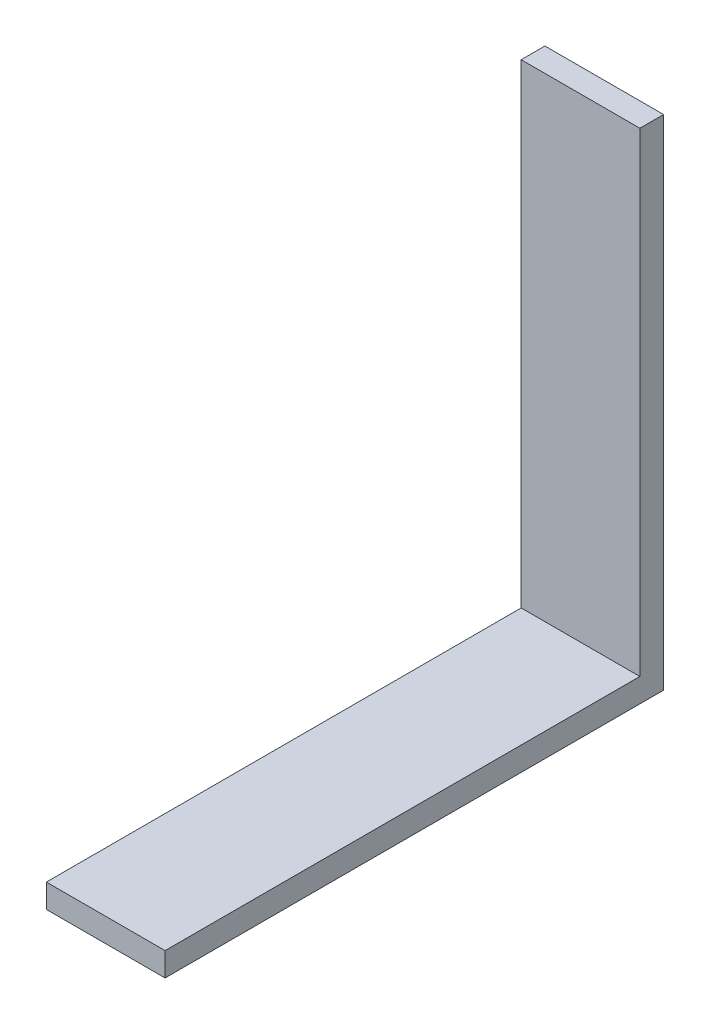
ISO-10303-21;
HEADER;
FILE_DESCRIPTION(('STEP AP214'),'2;1');
FILE_NAME('part.step','',(''),(''),'','','');
FILE_SCHEMA(('AUTOMOTIVE_DESIGN { 1 0 10303 214 1 1 1 1 }'));
ENDSEC;
DATA;
#1=APPLICATION_CONTEXT('core data for automotive mechanical design processes');
#2=APPLICATION_PROTOCOL_DEFINITION('international standard','automotive_design',2000,#1);
#3=PRODUCT_CONTEXT('',#1,'mechanical');
#4=PRODUCT('Part','Part','',(#3));
#5=PRODUCT_RELATED_PRODUCT_CATEGORY('part','',(#4));
#6=PRODUCT_DEFINITION_FORMATION('','',#4);
#7=PRODUCT_DEFINITION_CONTEXT('part definition',#1,'design');
#8=PRODUCT_DEFINITION('design','',#6,#7);
#9=PRODUCT_DEFINITION_SHAPE('','',#8);
#10=(LENGTH_UNIT() NAMED_UNIT(*) SI_UNIT(.MILLI.,.METRE.));
#11=(NAMED_UNIT(*) PLANE_ANGLE_UNIT() SI_UNIT($,.RADIAN.));
#12=(NAMED_UNIT(*) SI_UNIT($,.STERADIAN.) SOLID_ANGLE_UNIT());
#13=UNCERTAINTY_MEASURE_WITH_UNIT(LENGTH_MEASURE(1.E-05),#10,'distance_accuracy_value','');
#14=(GEOMETRIC_REPRESENTATION_CONTEXT(3) GLOBAL_UNCERTAINTY_ASSIGNED_CONTEXT((#13)) GLOBAL_UNIT_ASSIGNED_CONTEXT((#10,
#11,#12)) REPRESENTATION_CONTEXT('',''));
#15=CARTESIAN_POINT('',(0.,0.,0.));
#16=DIRECTION('',(0.,0.,1.));
#17=DIRECTION('',(1.,0.,0.));
#18=AXIS2_PLACEMENT_3D('',#15,#16,#17);
#19=CARTESIAN_POINT('',(5.,2.00000000000001,42.));
#20=DIRECTION('',(0.,0.,-1.));
#21=DIRECTION('',(-1.,0.,0.));
#22=AXIS2_PLACEMENT_3D('',#19,#20,#21);
#23=PLANE('',#22);
#24=DIRECTION('',(0.,-1.,0.));
#25=VECTOR('',#24,1.);
#26=CARTESIAN_POINT('',(-5.,2.00000000000001,42.));
#27=LINE('',#26,#25);
#28=CARTESIAN_POINT('',(-5.,2.00000000000001,42.));
#29=VERTEX_POINT('',#28);
#30=CARTESIAN_POINT('',(-5.,0.,42.));
#31=VERTEX_POINT('',#30);
#32=EDGE_CURVE('E116',#29,#31,#27,.T.);
#33=ORIENTED_EDGE('',*,*,#32,.T.);
#34=DIRECTION('',(-1.,0.,0.));
#35=VECTOR('',#34,1.);
#36=CARTESIAN_POINT('',(5.,0.,42.));
#37=LINE('',#36,#35);
#38=CARTESIAN_POINT('',(5.,0.,42.));
#39=VERTEX_POINT('',#38);
#40=EDGE_CURVE('E11',#39,#31,#37,.T.);
#41=ORIENTED_EDGE('',*,*,#40,.F.);
#42=DIRECTION('',(0.,-1.,0.));
#43=VECTOR('',#42,1.);
#44=CARTESIAN_POINT('',(5.,2.00000000000001,42.));
#45=LINE('',#44,#43);
#46=CARTESIAN_POINT('',(5.,2.00000000000001,42.));
#47=VERTEX_POINT('',#46);
#48=EDGE_CURVE('E126',#47,#39,#45,.T.);
#49=ORIENTED_EDGE('',*,*,#48,.F.);
#50=DIRECTION('',(-1.,0.,0.));
#51=VECTOR('',#50,1.);
#52=CARTESIAN_POINT('',(5.,2.00000000000001,42.));
#53=LINE('',#52,#51);
#54=EDGE_CURVE('E112',#47,#29,#53,.T.);
#55=ORIENTED_EDGE('',*,*,#54,.T.);
#56=EDGE_LOOP('',(#33,#41,#49,#55));
#57=FACE_BOUND('',#56,.T.);
#58=ADVANCED_FACE('F32',(#57),#23,.F.);
#59=CARTESIAN_POINT('',(5.,0.,42.));
#60=DIRECTION('',(0.,1.,0.));
#61=DIRECTION('',(0.,0.,1.));
#62=AXIS2_PLACEMENT_3D('',#59,#60,#61);
#63=PLANE('',#62);
#64=DIRECTION('',(0.,0.,-1.));
#65=VECTOR('',#64,1.);
#66=CARTESIAN_POINT('',(-5.,0.,42.));
#67=LINE('',#66,#65);
#68=CARTESIAN_POINT('',(-5.,0.,0.));
#69=VERTEX_POINT('',#68);
#70=EDGE_CURVE('E119',#31,#69,#67,.T.);
#71=ORIENTED_EDGE('',*,*,#70,.T.);
#72=DIRECTION('',(-1.,0.,0.));
#73=VECTOR('',#72,1.);
#74=CARTESIAN_POINT('',(5.,0.,0.));
#75=LINE('',#74,#73);
#76=CARTESIAN_POINT('',(5.,0.,0.));
#77=VERTEX_POINT('',#76);
#78=EDGE_CURVE('E40',#77,#69,#75,.T.);
#79=ORIENTED_EDGE('',*,*,#78,.F.);
#80=DIRECTION('',(0.,0.,-1.));
#81=VECTOR('',#80,1.);
#82=CARTESIAN_POINT('',(5.,0.,42.));
#83=LINE('',#82,#81);
#84=EDGE_CURVE('E85',#39,#77,#83,.T.);
#85=ORIENTED_EDGE('',*,*,#84,.F.);
#86=ORIENTED_EDGE('',*,*,#40,.T.);
#87=EDGE_LOOP('',(#71,#79,#85,#86));
#88=FACE_BOUND('',#87,.T.);
#89=ADVANCED_FACE('F150',(#88),#63,.F.);
#90=CARTESIAN_POINT('',(5.,0.,0.));
#91=DIRECTION('',(0.,0.,1.));
#92=DIRECTION('',(0.,-1.,0.));
#93=AXIS2_PLACEMENT_3D('',#90,#91,#92);
#94=PLANE('',#93);
#95=DIRECTION('',(0.,1.,0.));
#96=VECTOR('',#95,1.);
#97=CARTESIAN_POINT('',(-5.,0.,0.));
#98=LINE('',#97,#96);
#99=CARTESIAN_POINT('',(-5.,42.,0.));
#100=VERTEX_POINT('',#99);
#101=EDGE_CURVE('E121',#69,#100,#98,.T.);
#102=ORIENTED_EDGE('',*,*,#101,.T.);
#103=DIRECTION('',(-1.,0.,0.));
#104=VECTOR('',#103,1.);
#105=CARTESIAN_POINT('',(5.,42.,0.));
#106=LINE('',#105,#104);
#107=CARTESIAN_POINT('',(5.,42.,0.));
#108=VERTEX_POINT('',#107);
#109=EDGE_CURVE('E107',#108,#100,#106,.T.);
#110=ORIENTED_EDGE('',*,*,#109,.F.);
#111=DIRECTION('',(0.,1.,0.));
#112=VECTOR('',#111,1.);
#113=CARTESIAN_POINT('',(5.,0.,0.));
#114=LINE('',#113,#112);
#115=EDGE_CURVE('E98',#77,#108,#114,.T.);
#116=ORIENTED_EDGE('',*,*,#115,.F.);
#117=ORIENTED_EDGE('',*,*,#78,.T.);
#118=EDGE_LOOP('',(#102,#110,#116,#117));
#119=FACE_BOUND('',#118,.T.);
#120=ADVANCED_FACE('F132',(#119),#94,.F.);
#121=CARTESIAN_POINT('',(5.,42.,0.));
#122=DIRECTION('',(0.,-1.,0.));
#123=DIRECTION('',(0.,0.,-1.));
#124=AXIS2_PLACEMENT_3D('',#121,#122,#123);
#125=PLANE('',#124);
#126=DIRECTION('',(0.,0.,1.));
#127=VECTOR('',#126,1.);
#128=CARTESIAN_POINT('',(-5.,42.,0.));
#129=LINE('',#128,#127);
#130=CARTESIAN_POINT('',(-5.,42.,2.));
#131=VERTEX_POINT('',#130);
#132=EDGE_CURVE('E106',#100,#131,#129,.T.);
#133=ORIENTED_EDGE('',*,*,#132,.T.);
#134=DIRECTION('',(-1.,0.,0.));
#135=VECTOR('',#134,1.);
#136=CARTESIAN_POINT('',(5.,42.,2.));
#137=LINE('',#136,#135);
#138=CARTESIAN_POINT('',(5.,42.,2.));
#139=VERTEX_POINT('',#138);
#140=EDGE_CURVE('E103',#139,#131,#137,.T.);
#141=ORIENTED_EDGE('',*,*,#140,.F.);
#142=DIRECTION('',(0.,0.,1.));
#143=VECTOR('',#142,1.);
#144=CARTESIAN_POINT('',(5.,42.,0.));
#145=LINE('',#144,#143);
#146=EDGE_CURVE('E92',#108,#139,#145,.T.);
#147=ORIENTED_EDGE('',*,*,#146,.F.);
#148=ORIENTED_EDGE('',*,*,#109,.T.);
#149=EDGE_LOOP('',(#133,#141,#147,#148));
#150=FACE_BOUND('',#149,.T.);
#151=ADVANCED_FACE('F104',(#150),#125,.F.);
#152=CARTESIAN_POINT('',(5.,42.,2.));
#153=DIRECTION('',(0.,0.,-1.));
#154=DIRECTION('',(0.,1.,0.));
#155=AXIS2_PLACEMENT_3D('',#152,#153,#154);
#156=PLANE('',#155);
#157=DIRECTION('',(0.,-1.,0.));
#158=VECTOR('',#157,1.);
#159=CARTESIAN_POINT('',(-5.,42.,2.));
#160=LINE('',#159,#158);
#161=CARTESIAN_POINT('',(-5.,2.00000000000002,2.));
#162=VERTEX_POINT('',#161);
#163=EDGE_CURVE('E71',#131,#162,#160,.T.);
#164=ORIENTED_EDGE('',*,*,#163,.T.);
#165=DIRECTION('',(-1.,0.,0.));
#166=VECTOR('',#165,1.);
#167=CARTESIAN_POINT('',(5.,2.00000000000002,2.));
#168=LINE('',#167,#166);
#169=CARTESIAN_POINT('',(5.,2.00000000000002,2.));
#170=VERTEX_POINT('',#169);
#171=EDGE_CURVE('E108',#170,#162,#168,.T.);
#172=ORIENTED_EDGE('',*,*,#171,.F.);
#173=DIRECTION('',(0.,-1.,0.));
#174=VECTOR('',#173,1.);
#175=CARTESIAN_POINT('',(5.,42.,2.));
#176=LINE('',#175,#174);
#177=EDGE_CURVE('E96',#139,#170,#176,.T.);
#178=ORIENTED_EDGE('',*,*,#177,.F.);
#179=ORIENTED_EDGE('',*,*,#140,.T.);
#180=EDGE_LOOP('',(#164,#172,#178,#179));
#181=FACE_BOUND('',#180,.T.);
#182=ADVANCED_FACE('F110',(#181),#156,.F.);
#183=CARTESIAN_POINT('',(5.,2.00000000000002,2.));
#184=DIRECTION('',(0.,-1.,0.));
#185=DIRECTION('',(0.,0.,-1.));
#186=AXIS2_PLACEMENT_3D('',#183,#184,#185);
#187=PLANE('',#186);
#188=DIRECTION('',(0.,0.,1.));
#189=VECTOR('',#188,1.);
#190=CARTESIAN_POINT('',(-5.,2.00000000000002,2.));
#191=LINE('',#190,#189);
#192=EDGE_CURVE('E77',#162,#29,#191,.T.);
#193=ORIENTED_EDGE('',*,*,#192,.T.);
#194=ORIENTED_EDGE('',*,*,#54,.F.);
#195=DIRECTION('',(0.,0.,1.));
#196=VECTOR('',#195,1.);
#197=CARTESIAN_POINT('',(5.,2.00000000000002,2.));
#198=LINE('',#197,#196);
#199=EDGE_CURVE('E48',#170,#47,#198,.T.);
#200=ORIENTED_EDGE('',*,*,#199,.F.);
#201=ORIENTED_EDGE('',*,*,#171,.T.);
#202=EDGE_LOOP('',(#193,#194,#200,#201));
#203=FACE_BOUND('',#202,.T.);
#204=ADVANCED_FACE('F139',(#203),#187,.F.);
#205=CARTESIAN_POINT('',(5.,0.,0.));
#206=DIRECTION('',(1.,0.,0.));
#207=DIRECTION('',(0.,0.,-1.));
#208=AXIS2_PLACEMENT_3D('',#205,#206,#207);
#209=PLANE('',#208);
#210=ORIENTED_EDGE('',*,*,#48,.T.);
#211=ORIENTED_EDGE('',*,*,#84,.T.);
#212=ORIENTED_EDGE('',*,*,#115,.T.);
#213=ORIENTED_EDGE('',*,*,#146,.T.);
#214=ORIENTED_EDGE('',*,*,#177,.T.);
#215=ORIENTED_EDGE('',*,*,#199,.T.);
#216=EDGE_LOOP('',(#210,#211,#212,#213,#214,#215));
#217=FACE_BOUND('',#216,.T.);
#218=ADVANCED_FACE('F94',(#217),#209,.T.);
#219=CARTESIAN_POINT('',(-5.,0.,0.));
#220=DIRECTION('',(1.,0.,0.));
#221=DIRECTION('',(0.,0.,-1.));
#222=AXIS2_PLACEMENT_3D('',#219,#220,#221);
#223=PLANE('',#222);
#224=ORIENTED_EDGE('',*,*,#32,.F.);
#225=ORIENTED_EDGE('',*,*,#192,.F.);
#226=ORIENTED_EDGE('',*,*,#163,.F.);
#227=ORIENTED_EDGE('',*,*,#132,.F.);
#228=ORIENTED_EDGE('',*,*,#101,.F.);
#229=ORIENTED_EDGE('',*,*,#70,.F.);
#230=EDGE_LOOP('',(#224,#225,#226,#227,#228,#229));
#231=FACE_BOUND('',#230,.T.);
#232=ADVANCED_FACE('F135',(#231),#223,.F.);
#233=CLOSED_SHELL('',(#58,#89,#120,#151,#182,#204,#218,#232));
#234=MANIFOLD_SOLID_BREP('B2',#233);
#235=ADVANCED_BREP_SHAPE_REPRESENTATION('',(#18,#234),#14);
#236=SHAPE_DEFINITION_REPRESENTATION(#9,#235);
ENDSEC;
END-ISO-10303-21;
